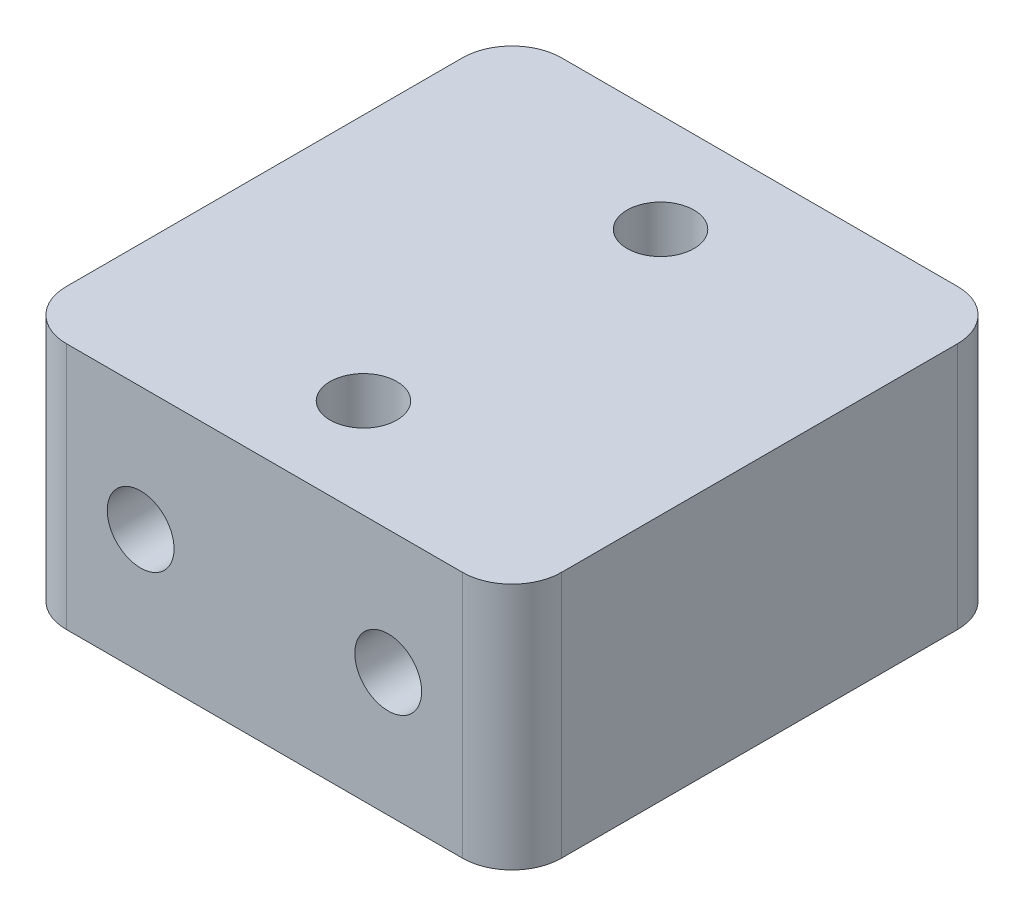
ISO-10303-21;
HEADER;
FILE_DESCRIPTION(('STEP AP214'),'2;1');
FILE_NAME('part.step','',(''),(''),'','','');
FILE_SCHEMA(('AUTOMOTIVE_DESIGN { 1 0 10303 214 1 1 1 1 }'));
ENDSEC;
DATA;
#1=APPLICATION_CONTEXT('core data for automotive mechanical design processes');
#2=APPLICATION_PROTOCOL_DEFINITION('international standard','automotive_design',2000,#1);
#3=PRODUCT_CONTEXT('',#1,'mechanical');
#4=PRODUCT('Part','Part','',(#3));
#5=PRODUCT_RELATED_PRODUCT_CATEGORY('part','',(#4));
#6=PRODUCT_DEFINITION_FORMATION('','',#4);
#7=PRODUCT_DEFINITION_CONTEXT('part definition',#1,'design');
#8=PRODUCT_DEFINITION('design','',#6,#7);
#9=PRODUCT_DEFINITION_SHAPE('','',#8);
#10=(LENGTH_UNIT() NAMED_UNIT(*) SI_UNIT(.MILLI.,.METRE.));
#11=(NAMED_UNIT(*) PLANE_ANGLE_UNIT() SI_UNIT($,.RADIAN.));
#12=(NAMED_UNIT(*) SI_UNIT($,.STERADIAN.) SOLID_ANGLE_UNIT());
#13=UNCERTAINTY_MEASURE_WITH_UNIT(LENGTH_MEASURE(1.E-05),#10,'distance_accuracy_value','');
#14=(GEOMETRIC_REPRESENTATION_CONTEXT(3) GLOBAL_UNCERTAINTY_ASSIGNED_CONTEXT((#13)) GLOBAL_UNIT_ASSIGNED_CONTEXT((#10,
#11,#12)) REPRESENTATION_CONTEXT('',''));
#15=CARTESIAN_POINT('',(0.,0.,0.));
#16=DIRECTION('',(0.,0.,1.));
#17=DIRECTION('',(1.,0.,0.));
#18=AXIS2_PLACEMENT_3D('',#15,#16,#17);
#19=CARTESIAN_POINT('',(0.,10.,0.));
#20=DIRECTION('',(0.,-1.,0.));
#21=DIRECTION('',(0.,0.,-1.));
#22=AXIS2_PLACEMENT_3D('',#19,#20,#21);
#23=PLANE('',#22);
#24=DIRECTION('',(1.,0.,0.));
#25=VECTOR('',#24,1.);
#26=CARTESIAN_POINT('',(-10.,10.,10.));
#27=LINE('',#26,#25);
#28=CARTESIAN_POINT('',(-8.,10.,10.));
#29=VERTEX_POINT('',#28);
#30=CARTESIAN_POINT('',(8.,10.,10.));
#31=VERTEX_POINT('',#30);
#32=EDGE_CURVE('E140',#29,#31,#27,.T.);
#33=ORIENTED_EDGE('',*,*,#32,.T.);
#34=CARTESIAN_POINT('',(8.,10.,8.));
#35=DIRECTION('',(0.,-1.,0.));
#36=DIRECTION('',(0.,0.,-1.));
#37=AXIS2_PLACEMENT_3D('',#34,#35,#36);
#38=CIRCLE('',#37,2.);
#39=CARTESIAN_POINT('',(10.,10.,8.));
#40=VERTEX_POINT('',#39);
#41=EDGE_CURVE('E158',#31,#40,#38,.F.);
#42=ORIENTED_EDGE('',*,*,#41,.T.);
#43=DIRECTION('',(0.,0.,-1.));
#44=VECTOR('',#43,1.);
#45=CARTESIAN_POINT('',(10.,10.,10.));
#46=LINE('',#45,#44);
#47=CARTESIAN_POINT('',(10.,10.,-8.));
#48=VERTEX_POINT('',#47);
#49=EDGE_CURVE('E122',#40,#48,#46,.T.);
#50=ORIENTED_EDGE('',*,*,#49,.T.);
#51=CARTESIAN_POINT('',(8.,10.,-8.));
#52=DIRECTION('',(0.,-1.,0.));
#53=DIRECTION('',(0.,0.,-1.));
#54=AXIS2_PLACEMENT_3D('',#51,#52,#53);
#55=CIRCLE('',#54,2.);
#56=CARTESIAN_POINT('',(8.,10.,-10.));
#57=VERTEX_POINT('',#56);
#58=EDGE_CURVE('E154',#48,#57,#55,.F.);
#59=ORIENTED_EDGE('',*,*,#58,.T.);
#60=DIRECTION('',(-1.,0.,0.));
#61=VECTOR('',#60,1.);
#62=CARTESIAN_POINT('',(-10.,10.,-10.));
#63=LINE('',#62,#61);
#64=CARTESIAN_POINT('',(-8.,10.,-10.));
#65=VERTEX_POINT('',#64);
#66=EDGE_CURVE('E167',#57,#65,#63,.T.);
#67=ORIENTED_EDGE('',*,*,#66,.T.);
#68=CARTESIAN_POINT('',(-8.,10.,-8.));
#69=DIRECTION('',(0.,-1.,0.));
#70=DIRECTION('',(0.,0.,-1.));
#71=AXIS2_PLACEMENT_3D('',#68,#69,#70);
#72=CIRCLE('',#71,2.);
#73=CARTESIAN_POINT('',(-10.,10.,-8.));
#74=VERTEX_POINT('',#73);
#75=EDGE_CURVE('E57',#65,#74,#72,.F.);
#76=ORIENTED_EDGE('',*,*,#75,.T.);
#77=DIRECTION('',(0.,0.,1.));
#78=VECTOR('',#77,1.);
#79=CARTESIAN_POINT('',(-10.,10.,10.));
#80=LINE('',#79,#78);
#81=CARTESIAN_POINT('',(-10.,10.,8.));
#82=VERTEX_POINT('',#81);
#83=EDGE_CURVE('E173',#74,#82,#80,.T.);
#84=ORIENTED_EDGE('',*,*,#83,.T.);
#85=CARTESIAN_POINT('',(-8.,10.,8.));
#86=DIRECTION('',(0.,-1.,0.));
#87=DIRECTION('',(0.,0.,-1.));
#88=AXIS2_PLACEMENT_3D('',#85,#86,#87);
#89=CIRCLE('',#88,2.);
#90=EDGE_CURVE('E156',#82,#29,#89,.F.);
#91=ORIENTED_EDGE('',*,*,#90,.T.);
#92=EDGE_LOOP('',(#33,#42,#50,#59,#67,#76,#84,#91));
#93=FACE_BOUND('',#92,.T.);
#94=CARTESIAN_POINT('',(0.,10.,-6.));
#95=DIRECTION('',(0.,1.,0.));
#96=DIRECTION('',(0.,0.,1.));
#97=AXIS2_PLACEMENT_3D('',#94,#95,#96);
#98=CIRCLE('',#97,1.35);
#99=CARTESIAN_POINT('',(0.,10.,-4.65));
#100=VERTEX_POINT('',#99);
#101=EDGE_CURVE('E131',#100,#100,#98,.T.);
#102=ORIENTED_EDGE('',*,*,#101,.F.);
#103=EDGE_LOOP('',(#102));
#104=FACE_BOUND('',#103,.T.);
#105=CARTESIAN_POINT('',(0.,10.,6.));
#106=DIRECTION('',(0.,1.,0.));
#107=DIRECTION('',(0.,0.,-1.));
#108=AXIS2_PLACEMENT_3D('',#105,#106,#107);
#109=CIRCLE('',#108,1.35);
#110=CARTESIAN_POINT('',(0.,10.,4.65));
#111=VERTEX_POINT('',#110);
#112=EDGE_CURVE('E188',#111,#111,#109,.T.);
#113=ORIENTED_EDGE('',*,*,#112,.F.);
#114=EDGE_LOOP('',(#113));
#115=FACE_BOUND('',#114,.T.);
#116=ADVANCED_FACE('F35',(#93,#104,#115),#23,.F.);
#117=CARTESIAN_POINT('',(0.,0.,0.));
#118=DIRECTION('',(0.,-1.,0.));
#119=DIRECTION('',(0.,0.,-1.));
#120=AXIS2_PLACEMENT_3D('',#117,#118,#119);
#121=PLANE('',#120);
#122=CARTESIAN_POINT('',(0.,0.,-6.));
#123=DIRECTION('',(0.,1.,0.));
#124=DIRECTION('',(0.,0.,1.));
#125=AXIS2_PLACEMENT_3D('',#122,#123,#124);
#126=CIRCLE('',#125,1.35);
#127=CARTESIAN_POINT('',(0.,0.,-4.65));
#128=VERTEX_POINT('',#127);
#129=EDGE_CURVE('E137',#128,#128,#126,.T.);
#130=ORIENTED_EDGE('',*,*,#129,.T.);
#131=EDGE_LOOP('',(#130));
#132=FACE_BOUND('',#131,.T.);
#133=DIRECTION('',(0.,0.,-1.));
#134=VECTOR('',#133,1.);
#135=CARTESIAN_POINT('',(10.,0.,10.));
#136=LINE('',#135,#134);
#137=CARTESIAN_POINT('',(10.,0.,8.));
#138=VERTEX_POINT('',#137);
#139=CARTESIAN_POINT('',(10.,0.,-8.));
#140=VERTEX_POINT('',#139);
#141=EDGE_CURVE('E119',#138,#140,#136,.T.);
#142=ORIENTED_EDGE('',*,*,#141,.F.);
#143=CARTESIAN_POINT('',(8.,0.,8.));
#144=DIRECTION('',(0.,-1.,0.));
#145=DIRECTION('',(0.,0.,-1.));
#146=AXIS2_PLACEMENT_3D('',#143,#144,#145);
#147=CIRCLE('',#146,2.);
#148=CARTESIAN_POINT('',(8.,0.,10.));
#149=VERTEX_POINT('',#148);
#150=EDGE_CURVE('E102',#138,#149,#147,.T.);
#151=ORIENTED_EDGE('',*,*,#150,.T.);
#152=DIRECTION('',(1.,0.,0.));
#153=VECTOR('',#152,1.);
#154=CARTESIAN_POINT('',(-10.,0.,10.));
#155=LINE('',#154,#153);
#156=CARTESIAN_POINT('',(-8.,0.,10.));
#157=VERTEX_POINT('',#156);
#158=EDGE_CURVE('E144',#157,#149,#155,.T.);
#159=ORIENTED_EDGE('',*,*,#158,.F.);
#160=CARTESIAN_POINT('',(-8.,0.,8.));
#161=DIRECTION('',(0.,-1.,0.));
#162=DIRECTION('',(0.,0.,-1.));
#163=AXIS2_PLACEMENT_3D('',#160,#161,#162);
#164=CIRCLE('',#163,2.);
#165=CARTESIAN_POINT('',(-10.,0.,8.));
#166=VERTEX_POINT('',#165);
#167=EDGE_CURVE('E113',#157,#166,#164,.T.);
#168=ORIENTED_EDGE('',*,*,#167,.T.);
#169=DIRECTION('',(0.,0.,1.));
#170=VECTOR('',#169,1.);
#171=CARTESIAN_POINT('',(-10.,0.,10.));
#172=LINE('',#171,#170);
#173=CARTESIAN_POINT('',(-10.,0.,-8.));
#174=VERTEX_POINT('',#173);
#175=EDGE_CURVE('E134',#174,#166,#172,.T.);
#176=ORIENTED_EDGE('',*,*,#175,.F.);
#177=CARTESIAN_POINT('',(-8.,0.,-8.));
#178=DIRECTION('',(0.,-1.,0.));
#179=DIRECTION('',(0.,0.,-1.));
#180=AXIS2_PLACEMENT_3D('',#177,#178,#179);
#181=CIRCLE('',#180,2.);
#182=CARTESIAN_POINT('',(-8.,0.,-10.));
#183=VERTEX_POINT('',#182);
#184=EDGE_CURVE('E123',#174,#183,#181,.T.);
#185=ORIENTED_EDGE('',*,*,#184,.T.);
#186=DIRECTION('',(-1.,0.,0.));
#187=VECTOR('',#186,1.);
#188=CARTESIAN_POINT('',(-10.,0.,-10.));
#189=LINE('',#188,#187);
#190=CARTESIAN_POINT('',(8.,0.,-10.));
#191=VERTEX_POINT('',#190);
#192=EDGE_CURVE('E130',#191,#183,#189,.T.);
#193=ORIENTED_EDGE('',*,*,#192,.F.);
#194=CARTESIAN_POINT('',(8.,0.,-8.));
#195=DIRECTION('',(0.,-1.,0.));
#196=DIRECTION('',(0.,0.,-1.));
#197=AXIS2_PLACEMENT_3D('',#194,#195,#196);
#198=CIRCLE('',#197,2.);
#199=EDGE_CURVE('E129',#191,#140,#198,.T.);
#200=ORIENTED_EDGE('',*,*,#199,.T.);
#201=EDGE_LOOP('',(#142,#151,#159,#168,#176,#185,#193,#200));
#202=FACE_BOUND('',#201,.T.);
#203=CARTESIAN_POINT('',(0.,0.,6.));
#204=DIRECTION('',(0.,1.,0.));
#205=DIRECTION('',(0.,0.,-1.));
#206=AXIS2_PLACEMENT_3D('',#203,#204,#205);
#207=CIRCLE('',#206,1.35);
#208=CARTESIAN_POINT('',(0.,0.,4.65));
#209=VERTEX_POINT('',#208);
#210=EDGE_CURVE('E190',#209,#209,#207,.T.);
#211=ORIENTED_EDGE('',*,*,#210,.T.);
#212=EDGE_LOOP('',(#211));
#213=FACE_BOUND('',#212,.T.);
#214=ADVANCED_FACE('F126',(#132,#202,#213),#121,.T.);
#215=CARTESIAN_POINT('',(10.,10.,10.));
#216=DIRECTION('',(-1.,0.,0.));
#217=DIRECTION('',(0.,0.,1.));
#218=AXIS2_PLACEMENT_3D('',#215,#216,#217);
#219=PLANE('',#218);
#220=ORIENTED_EDGE('',*,*,#49,.F.);
#221=DIRECTION('',(0.,-1.,0.));
#222=VECTOR('',#221,1.);
#223=CARTESIAN_POINT('',(10.,10.,8.));
#224=LINE('',#223,#222);
#225=EDGE_CURVE('E106',#40,#138,#224,.T.);
#226=ORIENTED_EDGE('',*,*,#225,.T.);
#227=ORIENTED_EDGE('',*,*,#141,.T.);
#228=DIRECTION('',(0.,-1.,0.));
#229=VECTOR('',#228,1.);
#230=CARTESIAN_POINT('',(10.,10.,-8.));
#231=LINE('',#230,#229);
#232=EDGE_CURVE('E124',#140,#48,#231,.F.);
#233=ORIENTED_EDGE('',*,*,#232,.T.);
#234=EDGE_LOOP('',(#220,#226,#227,#233));
#235=FACE_BOUND('',#234,.T.);
#236=ADVANCED_FACE('F118',(#235),#219,.F.);
#237=CARTESIAN_POINT('',(-10.,10.,-10.));
#238=DIRECTION('',(0.,0.,1.));
#239=DIRECTION('',(1.,0.,0.));
#240=AXIS2_PLACEMENT_3D('',#237,#238,#239);
#241=PLANE('',#240);
#242=CARTESIAN_POINT('',(-5.,5.,-10.));
#243=DIRECTION('',(0.,0.,-1.));
#244=DIRECTION('',(-1.,0.,0.));
#245=AXIS2_PLACEMENT_3D('',#242,#243,#244);
#246=CIRCLE('',#245,1.34999999999999);
#247=CARTESIAN_POINT('',(-6.34999999999999,5.,-10.));
#248=VERTEX_POINT('',#247);
#249=EDGE_CURVE('E202',#248,#248,#246,.T.);
#250=ORIENTED_EDGE('',*,*,#249,.F.);
#251=EDGE_LOOP('',(#250));
#252=FACE_BOUND('',#251,.T.);
#253=CARTESIAN_POINT('',(5.,5.,-10.));
#254=DIRECTION('',(0.,0.,-1.));
#255=DIRECTION('',(1.,0.,0.));
#256=AXIS2_PLACEMENT_3D('',#253,#254,#255);
#257=CIRCLE('',#256,1.34999999999999);
#258=CARTESIAN_POINT('',(6.34999999999999,5.,-10.));
#259=VERTEX_POINT('',#258);
#260=EDGE_CURVE('E196',#259,#259,#257,.T.);
#261=ORIENTED_EDGE('',*,*,#260,.F.);
#262=EDGE_LOOP('',(#261));
#263=FACE_BOUND('',#262,.T.);
#264=ORIENTED_EDGE('',*,*,#66,.F.);
#265=DIRECTION('',(0.,-1.,0.));
#266=VECTOR('',#265,1.);
#267=CARTESIAN_POINT('',(8.,10.,-10.));
#268=LINE('',#267,#266);
#269=EDGE_CURVE('E11',#57,#191,#268,.T.);
#270=ORIENTED_EDGE('',*,*,#269,.T.);
#271=ORIENTED_EDGE('',*,*,#192,.T.);
#272=DIRECTION('',(0.,-1.,0.));
#273=VECTOR('',#272,1.);
#274=CARTESIAN_POINT('',(-8.,10.,-10.));
#275=LINE('',#274,#273);
#276=EDGE_CURVE('E43',#183,#65,#275,.F.);
#277=ORIENTED_EDGE('',*,*,#276,.T.);
#278=EDGE_LOOP('',(#264,#270,#271,#277));
#279=FACE_BOUND('',#278,.T.);
#280=ADVANCED_FACE('F166',(#252,#263,#279),#241,.F.);
#281=CARTESIAN_POINT('',(-10.,10.,10.));
#282=DIRECTION('',(1.,0.,0.));
#283=DIRECTION('',(0.,0.,-1.));
#284=AXIS2_PLACEMENT_3D('',#281,#282,#283);
#285=PLANE('',#284);
#286=ORIENTED_EDGE('',*,*,#175,.T.);
#287=DIRECTION('',(0.,-1.,0.));
#288=VECTOR('',#287,1.);
#289=CARTESIAN_POINT('',(-10.,10.,8.));
#290=LINE('',#289,#288);
#291=EDGE_CURVE('E50',#166,#82,#290,.F.);
#292=ORIENTED_EDGE('',*,*,#291,.T.);
#293=ORIENTED_EDGE('',*,*,#83,.F.);
#294=DIRECTION('',(0.,-1.,0.));
#295=VECTOR('',#294,1.);
#296=CARTESIAN_POINT('',(-10.,10.,-8.));
#297=LINE('',#296,#295);
#298=EDGE_CURVE('E160',#74,#174,#297,.T.);
#299=ORIENTED_EDGE('',*,*,#298,.T.);
#300=EDGE_LOOP('',(#286,#292,#293,#299));
#301=FACE_BOUND('',#300,.T.);
#302=ADVANCED_FACE('F177',(#301),#285,.F.);
#303=CARTESIAN_POINT('',(-10.,10.,10.));
#304=DIRECTION('',(0.,0.,-1.));
#305=DIRECTION('',(-1.,0.,0.));
#306=AXIS2_PLACEMENT_3D('',#303,#304,#305);
#307=PLANE('',#306);
#308=CARTESIAN_POINT('',(-5.,5.,10.));
#309=DIRECTION('',(0.,0.,-1.));
#310=DIRECTION('',(-1.,0.,0.));
#311=AXIS2_PLACEMENT_3D('',#308,#309,#310);
#312=CIRCLE('',#311,1.34999999999999);
#313=CARTESIAN_POINT('',(-6.34999999999999,5.,10.));
#314=VERTEX_POINT('',#313);
#315=EDGE_CURVE('E193',#314,#314,#312,.T.);
#316=ORIENTED_EDGE('',*,*,#315,.T.);
#317=EDGE_LOOP('',(#316));
#318=FACE_BOUND('',#317,.T.);
#319=CARTESIAN_POINT('',(5.,5.,10.));
#320=DIRECTION('',(0.,0.,-1.));
#321=DIRECTION('',(1.,0.,0.));
#322=AXIS2_PLACEMENT_3D('',#319,#320,#321);
#323=CIRCLE('',#322,1.34999999999999);
#324=CARTESIAN_POINT('',(6.34999999999999,5.,10.));
#325=VERTEX_POINT('',#324);
#326=EDGE_CURVE('E199',#325,#325,#323,.T.);
#327=ORIENTED_EDGE('',*,*,#326,.T.);
#328=EDGE_LOOP('',(#327));
#329=FACE_BOUND('',#328,.T.);
#330=ORIENTED_EDGE('',*,*,#158,.T.);
#331=DIRECTION('',(0.,-1.,0.));
#332=VECTOR('',#331,1.);
#333=CARTESIAN_POINT('',(8.,10.,10.));
#334=LINE('',#333,#332);
#335=EDGE_CURVE('E107',#149,#31,#334,.F.);
#336=ORIENTED_EDGE('',*,*,#335,.T.);
#337=ORIENTED_EDGE('',*,*,#32,.F.);
#338=DIRECTION('',(0.,-1.,0.));
#339=VECTOR('',#338,1.);
#340=CARTESIAN_POINT('',(-8.,10.,10.));
#341=LINE('',#340,#339);
#342=EDGE_CURVE('E112',#29,#157,#341,.T.);
#343=ORIENTED_EDGE('',*,*,#342,.T.);
#344=EDGE_LOOP('',(#330,#336,#337,#343));
#345=FACE_BOUND('',#344,.T.);
#346=ADVANCED_FACE('F184',(#318,#329,#345),#307,.F.);
#347=CARTESIAN_POINT('',(0.,10.,-6.));
#348=DIRECTION('',(0.,-1.,0.));
#349=DIRECTION('',(0.,0.,-1.));
#350=AXIS2_PLACEMENT_3D('',#347,#348,#349);
#351=CYLINDRICAL_SURFACE('',#350,1.35);
#352=ORIENTED_EDGE('',*,*,#101,.T.);
#353=EDGE_LOOP('',(#352));
#354=FACE_BOUND('',#353,.T.);
#355=ORIENTED_EDGE('',*,*,#129,.F.);
#356=EDGE_LOOP('',(#355));
#357=FACE_BOUND('',#356,.T.);
#358=ADVANCED_FACE('F229',(#354,#357),#351,.F.);
#359=CARTESIAN_POINT('',(0.,10.,6.));
#360=DIRECTION('',(0.,-1.,0.));
#361=DIRECTION('',(0.,0.,-1.));
#362=AXIS2_PLACEMENT_3D('',#359,#360,#361);
#363=CYLINDRICAL_SURFACE('',#362,1.35);
#364=ORIENTED_EDGE('',*,*,#112,.T.);
#365=EDGE_LOOP('',(#364));
#366=FACE_BOUND('',#365,.T.);
#367=ORIENTED_EDGE('',*,*,#210,.F.);
#368=EDGE_LOOP('',(#367));
#369=FACE_BOUND('',#368,.T.);
#370=ADVANCED_FACE('F223',(#366,#369),#363,.F.);
#371=CARTESIAN_POINT('',(5.,5.,10.));
#372=DIRECTION('',(0.,0.,-1.));
#373=DIRECTION('',(-1.,0.,0.));
#374=AXIS2_PLACEMENT_3D('',#371,#372,#373);
#375=CYLINDRICAL_SURFACE('',#374,1.34999999999999);
#376=ORIENTED_EDGE('',*,*,#326,.F.);
#377=EDGE_LOOP('',(#376));
#378=FACE_BOUND('',#377,.T.);
#379=ORIENTED_EDGE('',*,*,#260,.T.);
#380=EDGE_LOOP('',(#379));
#381=FACE_BOUND('',#380,.T.);
#382=ADVANCED_FACE('F213',(#378,#381),#375,.F.);
#383=CARTESIAN_POINT('',(-5.,5.,10.));
#384=DIRECTION('',(0.,0.,-1.));
#385=DIRECTION('',(-1.,0.,0.));
#386=AXIS2_PLACEMENT_3D('',#383,#384,#385);
#387=CYLINDRICAL_SURFACE('',#386,1.34999999999999);
#388=ORIENTED_EDGE('',*,*,#315,.F.);
#389=EDGE_LOOP('',(#388));
#390=FACE_BOUND('',#389,.T.);
#391=ORIENTED_EDGE('',*,*,#249,.T.);
#392=EDGE_LOOP('',(#391));
#393=FACE_BOUND('',#392,.T.);
#394=ADVANCED_FACE('F210',(#390,#393),#387,.F.);
#395=CARTESIAN_POINT('',(8.,10.,8.));
#396=DIRECTION('',(0.,-1.,0.));
#397=DIRECTION('',(0.,0.,-1.));
#398=AXIS2_PLACEMENT_3D('',#395,#396,#397);
#399=CYLINDRICAL_SURFACE('',#398,2.);
#400=ORIENTED_EDGE('',*,*,#41,.F.);
#401=ORIENTED_EDGE('',*,*,#335,.F.);
#402=ORIENTED_EDGE('',*,*,#150,.F.);
#403=ORIENTED_EDGE('',*,*,#225,.F.);
#404=EDGE_LOOP('',(#400,#401,#402,#403));
#405=FACE_BOUND('',#404,.T.);
#406=ADVANCED_FACE('F105',(#405),#399,.T.);
#407=CARTESIAN_POINT('',(-8.,10.,8.));
#408=DIRECTION('',(0.,-1.,0.));
#409=DIRECTION('',(0.,0.,-1.));
#410=AXIS2_PLACEMENT_3D('',#407,#408,#409);
#411=CYLINDRICAL_SURFACE('',#410,2.);
#412=ORIENTED_EDGE('',*,*,#90,.F.);
#413=ORIENTED_EDGE('',*,*,#291,.F.);
#414=ORIENTED_EDGE('',*,*,#167,.F.);
#415=ORIENTED_EDGE('',*,*,#342,.F.);
#416=EDGE_LOOP('',(#412,#413,#414,#415));
#417=FACE_BOUND('',#416,.T.);
#418=ADVANCED_FACE('F181',(#417),#411,.T.);
#419=CARTESIAN_POINT('',(8.,10.,-8.));
#420=DIRECTION('',(0.,-1.,0.));
#421=DIRECTION('',(0.,0.,-1.));
#422=AXIS2_PLACEMENT_3D('',#419,#420,#421);
#423=CYLINDRICAL_SURFACE('',#422,2.);
#424=ORIENTED_EDGE('',*,*,#58,.F.);
#425=ORIENTED_EDGE('',*,*,#232,.F.);
#426=ORIENTED_EDGE('',*,*,#199,.F.);
#427=ORIENTED_EDGE('',*,*,#269,.F.);
#428=EDGE_LOOP('',(#424,#425,#426,#427));
#429=FACE_BOUND('',#428,.T.);
#430=ADVANCED_FACE('F251',(#429),#423,.T.);
#431=CARTESIAN_POINT('',(-8.,10.,-8.));
#432=DIRECTION('',(0.,-1.,0.));
#433=DIRECTION('',(0.,0.,-1.));
#434=AXIS2_PLACEMENT_3D('',#431,#432,#433);
#435=CYLINDRICAL_SURFACE('',#434,2.);
#436=ORIENTED_EDGE('',*,*,#75,.F.);
#437=ORIENTED_EDGE('',*,*,#276,.F.);
#438=ORIENTED_EDGE('',*,*,#184,.F.);
#439=ORIENTED_EDGE('',*,*,#298,.F.);
#440=EDGE_LOOP('',(#436,#437,#438,#439));
#441=FACE_BOUND('',#440,.T.);
#442=ADVANCED_FACE('F37',(#441),#435,.T.);
#443=CLOSED_SHELL('',(#116,#214,#236,#280,#302,#346,#358,#370,#382,#394,#406,#418,#430,#442));
#444=MANIFOLD_SOLID_BREP('B2',#443);
#445=ADVANCED_BREP_SHAPE_REPRESENTATION('',(#18,#444),#14);
#446=SHAPE_DEFINITION_REPRESENTATION(#9,#445);
ENDSEC;
END-ISO-10303-21;
